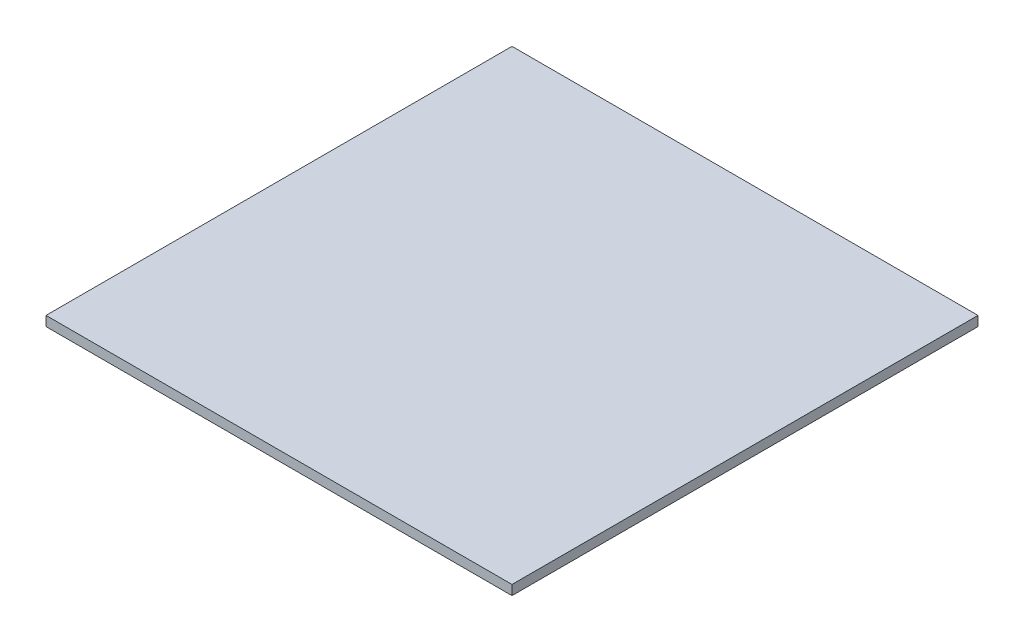
ISO-10303-21;
HEADER;
FILE_DESCRIPTION(('STEP AP214'),'2;1');
FILE_NAME('part.step','',(''),(''),'','','');
FILE_SCHEMA(('AUTOMOTIVE_DESIGN { 1 0 10303 214 1 1 1 1 }'));
ENDSEC;
DATA;
#1=APPLICATION_CONTEXT('core data for automotive mechanical design processes');
#2=APPLICATION_PROTOCOL_DEFINITION('international standard','automotive_design',2000,#1);
#3=PRODUCT_CONTEXT('',#1,'mechanical');
#4=PRODUCT('Part','Part','',(#3));
#5=PRODUCT_RELATED_PRODUCT_CATEGORY('part','',(#4));
#6=PRODUCT_DEFINITION_FORMATION('','',#4);
#7=PRODUCT_DEFINITION_CONTEXT('part definition',#1,'design');
#8=PRODUCT_DEFINITION('design','',#6,#7);
#9=PRODUCT_DEFINITION_SHAPE('','',#8);
#10=(LENGTH_UNIT() NAMED_UNIT(*) SI_UNIT(.MILLI.,.METRE.));
#11=(NAMED_UNIT(*) PLANE_ANGLE_UNIT() SI_UNIT($,.RADIAN.));
#12=(NAMED_UNIT(*) SI_UNIT($,.STERADIAN.) SOLID_ANGLE_UNIT());
#13=UNCERTAINTY_MEASURE_WITH_UNIT(LENGTH_MEASURE(1.E-05),#10,'distance_accuracy_value','');
#14=(GEOMETRIC_REPRESENTATION_CONTEXT(3) GLOBAL_UNCERTAINTY_ASSIGNED_CONTEXT((#13)) GLOBAL_UNIT_ASSIGNED_CONTEXT((#10,
#11,#12)) REPRESENTATION_CONTEXT('',''));
#15=CARTESIAN_POINT('',(0.,0.,0.));
#16=DIRECTION('',(0.,0.,1.));
#17=DIRECTION('',(1.,0.,0.));
#18=AXIS2_PLACEMENT_3D('',#15,#16,#17);
#19=CARTESIAN_POINT('',(0.,5.,0.));
#20=DIRECTION('',(1.,0.,0.));
#21=DIRECTION('',(0.,0.,-1.));
#22=AXIS2_PLACEMENT_3D('',#19,#20,#21);
#23=PLANE('',#22);
#24=DIRECTION('',(0.,0.,1.));
#25=VECTOR('',#24,1.);
#26=CARTESIAN_POINT('',(0.,0.,0.));
#27=LINE('',#26,#25);
#28=CARTESIAN_POINT('',(0.,0.,0.));
#29=VERTEX_POINT('',#28);
#30=CARTESIAN_POINT('',(0.,0.,240.));
#31=VERTEX_POINT('',#30);
#32=EDGE_CURVE('E96',#29,#31,#27,.T.);
#33=ORIENTED_EDGE('',*,*,#32,.T.);
#34=DIRECTION('',(0.,-1.,0.));
#35=VECTOR('',#34,1.);
#36=CARTESIAN_POINT('',(0.,5.,240.));
#37=LINE('',#36,#35);
#38=CARTESIAN_POINT('',(0.,5.,240.));
#39=VERTEX_POINT('',#38);
#40=EDGE_CURVE('E11',#39,#31,#37,.T.);
#41=ORIENTED_EDGE('',*,*,#40,.F.);
#42=DIRECTION('',(0.,0.,1.));
#43=VECTOR('',#42,1.);
#44=CARTESIAN_POINT('',(0.,5.,0.));
#45=LINE('',#44,#43);
#46=CARTESIAN_POINT('',(0.,5.,0.));
#47=VERTEX_POINT('',#46);
#48=EDGE_CURVE('E84',#47,#39,#45,.T.);
#49=ORIENTED_EDGE('',*,*,#48,.F.);
#50=DIRECTION('',(0.,-1.,0.));
#51=VECTOR('',#50,1.);
#52=CARTESIAN_POINT('',(0.,5.,0.));
#53=LINE('',#52,#51);
#54=EDGE_CURVE('E92',#47,#29,#53,.T.);
#55=ORIENTED_EDGE('',*,*,#54,.T.);
#56=EDGE_LOOP('',(#33,#41,#49,#55));
#57=FACE_BOUND('',#56,.T.);
#58=ADVANCED_FACE('F33',(#57),#23,.F.);
#59=CARTESIAN_POINT('',(0.,5.,240.));
#60=DIRECTION('',(0.,0.,-1.));
#61=DIRECTION('',(-1.,0.,0.));
#62=AXIS2_PLACEMENT_3D('',#59,#60,#61);
#63=PLANE('',#62);
#64=DIRECTION('',(1.,0.,0.));
#65=VECTOR('',#64,1.);
#66=CARTESIAN_POINT('',(0.,0.,240.));
#67=LINE('',#66,#65);
#68=CARTESIAN_POINT('',(240.,0.,240.));
#69=VERTEX_POINT('',#68);
#70=EDGE_CURVE('E88',#31,#69,#67,.T.);
#71=ORIENTED_EDGE('',*,*,#70,.T.);
#72=DIRECTION('',(0.,-1.,0.));
#73=VECTOR('',#72,1.);
#74=CARTESIAN_POINT('',(240.,5.,240.));
#75=LINE('',#74,#73);
#76=CARTESIAN_POINT('',(240.,5.,240.));
#77=VERTEX_POINT('',#76);
#78=EDGE_CURVE('E41',#77,#69,#75,.T.);
#79=ORIENTED_EDGE('',*,*,#78,.F.);
#80=DIRECTION('',(1.,0.,0.));
#81=VECTOR('',#80,1.);
#82=CARTESIAN_POINT('',(0.,5.,240.));
#83=LINE('',#82,#81);
#84=EDGE_CURVE('E79',#39,#77,#83,.T.);
#85=ORIENTED_EDGE('',*,*,#84,.F.);
#86=ORIENTED_EDGE('',*,*,#40,.T.);
#87=EDGE_LOOP('',(#71,#79,#85,#86));
#88=FACE_BOUND('',#87,.T.);
#89=ADVANCED_FACE('F87',(#88),#63,.F.);
#90=CARTESIAN_POINT('',(240.,5.,0.));
#91=DIRECTION('',(-1.,0.,0.));
#92=DIRECTION('',(0.,0.,1.));
#93=AXIS2_PLACEMENT_3D('',#90,#91,#92);
#94=PLANE('',#93);
#95=DIRECTION('',(0.,0.,-1.));
#96=VECTOR('',#95,1.);
#97=CARTESIAN_POINT('',(240.,0.,0.));
#98=LINE('',#97,#96);
#99=CARTESIAN_POINT('',(240.,0.,0.));
#100=VERTEX_POINT('',#99);
#101=EDGE_CURVE('E66',#69,#100,#98,.T.);
#102=ORIENTED_EDGE('',*,*,#101,.T.);
#103=DIRECTION('',(0.,-1.,0.));
#104=VECTOR('',#103,1.);
#105=CARTESIAN_POINT('',(240.,5.,0.));
#106=LINE('',#105,#104);
#107=CARTESIAN_POINT('',(240.,5.,0.));
#108=VERTEX_POINT('',#107);
#109=EDGE_CURVE('E89',#108,#100,#106,.T.);
#110=ORIENTED_EDGE('',*,*,#109,.F.);
#111=DIRECTION('',(0.,0.,-1.));
#112=VECTOR('',#111,1.);
#113=CARTESIAN_POINT('',(240.,5.,0.));
#114=LINE('',#113,#112);
#115=EDGE_CURVE('E82',#77,#108,#114,.T.);
#116=ORIENTED_EDGE('',*,*,#115,.F.);
#117=ORIENTED_EDGE('',*,*,#78,.T.);
#118=EDGE_LOOP('',(#102,#110,#116,#117));
#119=FACE_BOUND('',#118,.T.);
#120=ADVANCED_FACE('F90',(#119),#94,.F.);
#121=CARTESIAN_POINT('',(0.,5.,0.));
#122=DIRECTION('',(0.,0.,1.));
#123=DIRECTION('',(1.,0.,0.));
#124=AXIS2_PLACEMENT_3D('',#121,#122,#123);
#125=PLANE('',#124);
#126=DIRECTION('',(-1.,0.,0.));
#127=VECTOR('',#126,1.);
#128=CARTESIAN_POINT('',(0.,0.,0.));
#129=LINE('',#128,#127);
#130=EDGE_CURVE('E72',#100,#29,#129,.T.);
#131=ORIENTED_EDGE('',*,*,#130,.T.);
#132=ORIENTED_EDGE('',*,*,#54,.F.);
#133=DIRECTION('',(-1.,0.,0.));
#134=VECTOR('',#133,1.);
#135=CARTESIAN_POINT('',(0.,5.,0.));
#136=LINE('',#135,#134);
#137=EDGE_CURVE('E49',#108,#47,#136,.T.);
#138=ORIENTED_EDGE('',*,*,#137,.F.);
#139=ORIENTED_EDGE('',*,*,#109,.T.);
#140=EDGE_LOOP('',(#131,#132,#138,#139));
#141=FACE_BOUND('',#140,.T.);
#142=ADVANCED_FACE('F103',(#141),#125,.F.);
#143=CARTESIAN_POINT('',(0.,5.,0.));
#144=DIRECTION('',(0.,1.,0.));
#145=DIRECTION('',(0.,0.,1.));
#146=AXIS2_PLACEMENT_3D('',#143,#144,#145);
#147=PLANE('',#146);
#148=ORIENTED_EDGE('',*,*,#48,.T.);
#149=ORIENTED_EDGE('',*,*,#84,.T.);
#150=ORIENTED_EDGE('',*,*,#115,.T.);
#151=ORIENTED_EDGE('',*,*,#137,.T.);
#152=EDGE_LOOP('',(#148,#149,#150,#151));
#153=FACE_BOUND('',#152,.T.);
#154=ADVANCED_FACE('F80',(#153),#147,.T.);
#155=CARTESIAN_POINT('',(0.,0.,0.));
#156=DIRECTION('',(0.,1.,0.));
#157=DIRECTION('',(0.,0.,1.));
#158=AXIS2_PLACEMENT_3D('',#155,#156,#157);
#159=PLANE('',#158);
#160=ORIENTED_EDGE('',*,*,#32,.F.);
#161=ORIENTED_EDGE('',*,*,#130,.F.);
#162=ORIENTED_EDGE('',*,*,#101,.F.);
#163=ORIENTED_EDGE('',*,*,#70,.F.);
#164=EDGE_LOOP('',(#160,#161,#162,#163));
#165=FACE_BOUND('',#164,.T.);
#166=ADVANCED_FACE('F106',(#165),#159,.F.);
#167=CLOSED_SHELL('',(#58,#89,#120,#142,#154,#166));
#168=MANIFOLD_SOLID_BREP('B2',#167);
#169=ADVANCED_BREP_SHAPE_REPRESENTATION('',(#18,#168),#14);
#170=SHAPE_DEFINITION_REPRESENTATION(#9,#169);
ENDSEC;
END-ISO-10303-21;
